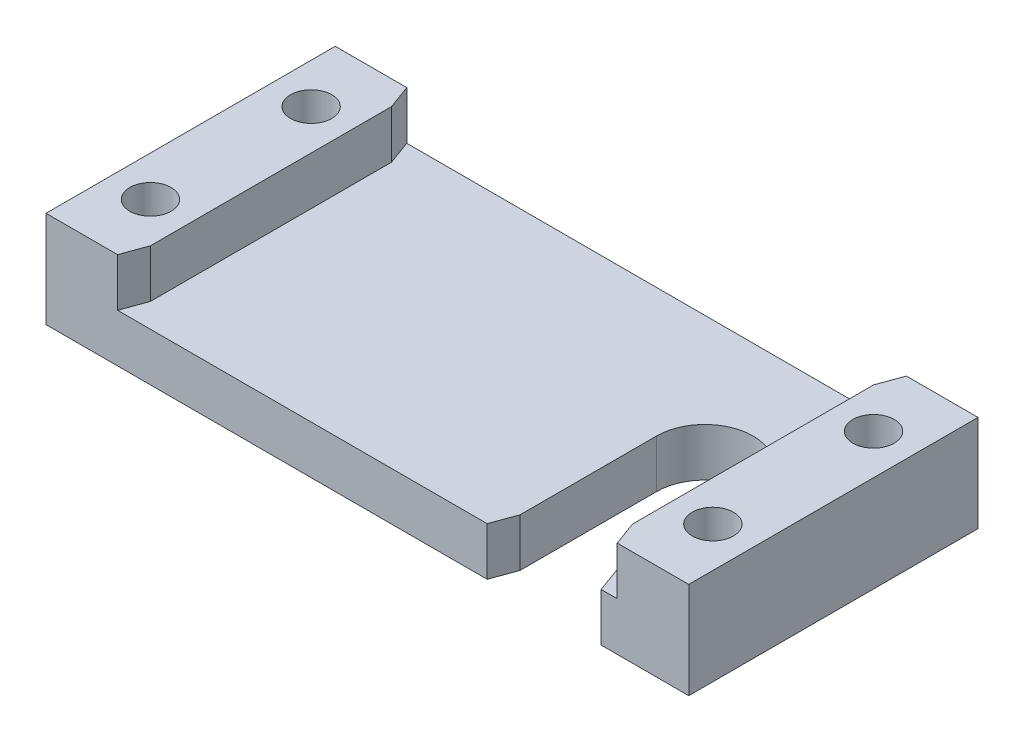
ISO-10303-21;
HEADER;
FILE_DESCRIPTION(('STEP AP214'),'2;1');
FILE_NAME('part.step','',(''),(''),'','','');
FILE_SCHEMA(('AUTOMOTIVE_DESIGN { 1 0 10303 214 1 1 1 1 }'));
ENDSEC;
DATA;
#1=APPLICATION_CONTEXT('core data for automotive mechanical design processes');
#2=APPLICATION_PROTOCOL_DEFINITION('international standard','automotive_design',2000,#1);
#3=PRODUCT_CONTEXT('',#1,'mechanical');
#4=PRODUCT('Part','Part','',(#3));
#5=PRODUCT_RELATED_PRODUCT_CATEGORY('part','',(#4));
#6=PRODUCT_DEFINITION_FORMATION('','',#4);
#7=PRODUCT_DEFINITION_CONTEXT('part definition',#1,'design');
#8=PRODUCT_DEFINITION('design','',#6,#7);
#9=PRODUCT_DEFINITION_SHAPE('','',#8);
#10=(LENGTH_UNIT() NAMED_UNIT(*) SI_UNIT(.MILLI.,.METRE.));
#11=(NAMED_UNIT(*) PLANE_ANGLE_UNIT() SI_UNIT($,.RADIAN.));
#12=(NAMED_UNIT(*) SI_UNIT($,.STERADIAN.) SOLID_ANGLE_UNIT());
#13=UNCERTAINTY_MEASURE_WITH_UNIT(LENGTH_MEASURE(1.E-05),#10,'distance_accuracy_value','');
#14=(GEOMETRIC_REPRESENTATION_CONTEXT(3) GLOBAL_UNCERTAINTY_ASSIGNED_CONTEXT((#13)) GLOBAL_UNIT_ASSIGNED_CONTEXT((#10,
#11,#12)) REPRESENTATION_CONTEXT('',''));
#15=CARTESIAN_POINT('',(0.,0.,0.));
#16=DIRECTION('',(0.,0.,1.));
#17=DIRECTION('',(1.,0.,0.));
#18=AXIS2_PLACEMENT_3D('',#15,#16,#17);
#19=CARTESIAN_POINT('',(0.,0.,11.43));
#20=DIRECTION('',(0.,0.,1.));
#21=DIRECTION('',(1.,0.,0.));
#22=AXIS2_PLACEMENT_3D('',#19,#20,#21);
#23=PLANE('',#22);
#24=DIRECTION('',(1.,0.,0.));
#25=VECTOR('',#24,1.);
#26=CARTESIAN_POINT('',(0.,0.,11.43));
#27=LINE('',#26,#25);
#28=CARTESIAN_POINT('',(18.4733632962771,0.,11.43));
#29=VERTEX_POINT('',#28);
#30=CARTESIAN_POINT('',(19.7433632962771,0.,11.43));
#31=VERTEX_POINT('',#30);
#32=EDGE_CURVE('E252',#29,#31,#27,.T.);
#33=ORIENTED_EDGE('',*,*,#32,.F.);
#34=DIRECTION('',(0.,-1.,0.));
#35=VECTOR('',#34,1.);
#36=CARTESIAN_POINT('',(18.4733632962771,-3.81,11.43));
#37=LINE('',#36,#35);
#38=CARTESIAN_POINT('',(18.4733632962771,-3.81,11.43));
#39=VERTEX_POINT('',#38);
#40=EDGE_CURVE('E344',#29,#39,#37,.T.);
#41=ORIENTED_EDGE('',*,*,#40,.T.);
#42=DIRECTION('',(1.,0.,0.));
#43=VECTOR('',#42,1.);
#44=CARTESIAN_POINT('',(0.,-3.81,11.43));
#45=LINE('',#44,#43);
#46=CARTESIAN_POINT('',(25.4,-3.81,11.43));
#47=VERTEX_POINT('',#46);
#48=EDGE_CURVE('E262',#39,#47,#45,.T.);
#49=ORIENTED_EDGE('',*,*,#48,.T.);
#50=DIRECTION('',(0.,-1.,0.));
#51=VECTOR('',#50,1.);
#52=CARTESIAN_POINT('',(25.4,0.,11.43));
#53=LINE('',#52,#51);
#54=CARTESIAN_POINT('',(25.4,3.81,11.43));
#55=VERTEX_POINT('',#54);
#56=EDGE_CURVE('E267',#55,#47,#53,.T.);
#57=ORIENTED_EDGE('',*,*,#56,.F.);
#58=DIRECTION('',(1.,0.,0.));
#59=VECTOR('',#58,1.);
#60=CARTESIAN_POINT('',(0.,3.81,11.43));
#61=LINE('',#60,#59);
#62=CARTESIAN_POINT('',(19.7433632962771,3.81,11.43));
#63=VERTEX_POINT('',#62);
#64=EDGE_CURVE('E249',#63,#55,#61,.T.);
#65=ORIENTED_EDGE('',*,*,#64,.F.);
#66=DIRECTION('',(0.,-1.,0.));
#67=VECTOR('',#66,1.);
#68=CARTESIAN_POINT('',(19.7433632962771,0.,11.43));
#69=LINE('',#68,#67);
#70=EDGE_CURVE('E340',#63,#31,#69,.T.);
#71=ORIENTED_EDGE('',*,*,#70,.T.);
#72=EDGE_LOOP('',(#33,#41,#49,#57,#65,#71));
#73=FACE_BOUND('',#72,.T.);
#74=ADVANCED_FACE('F45',(#73),#23,.T.);
#75=CARTESIAN_POINT('',(0.,3.81,11.43));
#76=DIRECTION('',(0.,1.,0.));
#77=DIRECTION('',(0.,0.,1.));
#78=AXIS2_PLACEMENT_3D('',#75,#76,#77);
#79=PLANE('',#78);
#80=CARTESIAN_POINT('',(22.225,3.81,6.35));
#81=DIRECTION('',(0.,1.,0.));
#82=DIRECTION('',(0.,0.,1.));
#83=AXIS2_PLACEMENT_3D('',#80,#81,#82);
#84=CIRCLE('',#83,1.63195);
#85=CARTESIAN_POINT('',(22.225,3.81,7.98195));
#86=VERTEX_POINT('',#85);
#87=EDGE_CURVE('E215',#86,#86,#84,.T.);
#88=ORIENTED_EDGE('',*,*,#87,.F.);
#89=EDGE_LOOP('',(#88));
#90=FACE_BOUND('',#89,.T.);
#91=CARTESIAN_POINT('',(22.225,3.81,-6.35));
#92=DIRECTION('',(0.,1.,0.));
#93=DIRECTION('',(0.,0.,1.));
#94=AXIS2_PLACEMENT_3D('',#91,#92,#93);
#95=CIRCLE('',#94,1.63195);
#96=CARTESIAN_POINT('',(22.225,3.81,-4.71805));
#97=VERTEX_POINT('',#96);
#98=EDGE_CURVE('E240',#97,#97,#95,.T.);
#99=ORIENTED_EDGE('',*,*,#98,.F.);
#100=EDGE_LOOP('',(#99));
#101=FACE_BOUND('',#100,.T.);
#102=DIRECTION('',(1.,0.,0.));
#103=VECTOR('',#102,1.);
#104=CARTESIAN_POINT('',(0.,3.81,-11.43));
#105=LINE('',#104,#103);
#106=CARTESIAN_POINT('',(19.7433632962771,3.81,-11.43));
#107=VERTEX_POINT('',#106);
#108=CARTESIAN_POINT('',(25.4,3.81,-11.43));
#109=VERTEX_POINT('',#108);
#110=EDGE_CURVE('E248',#107,#109,#105,.T.);
#111=ORIENTED_EDGE('',*,*,#110,.F.);
#112=DIRECTION('',(0.342020143325667,0.,-0.939692620785909));
#113=VECTOR('',#112,1.);
#114=CARTESIAN_POINT('',(10.0867661402176,3.81,15.1012826350434));
#115=LINE('',#114,#113);
#116=CARTESIAN_POINT('',(19.05,3.81,-9.52499999999997));
#117=VERTEX_POINT('',#116);
#118=EDGE_CURVE('E364',#107,#117,#115,.F.);
#119=ORIENTED_EDGE('',*,*,#118,.T.);
#120=DIRECTION('',(0.,0.,-1.));
#121=VECTOR('',#120,1.);
#122=CARTESIAN_POINT('',(19.05,3.81,11.43));
#123=LINE('',#122,#121);
#124=CARTESIAN_POINT('',(19.05,3.81,9.52499999999997));
#125=VERTEX_POINT('',#124);
#126=EDGE_CURVE('E311',#125,#117,#123,.T.);
#127=ORIENTED_EDGE('',*,*,#126,.F.);
#128=DIRECTION('',(0.342020143325667,0.,0.939692620785909));
#129=VECTOR('',#128,1.);
#130=CARTESIAN_POINT('',(17.4338285189347,3.81,5.08460534980657));
#131=LINE('',#130,#129);
#132=EDGE_CURVE('E361',#125,#63,#131,.T.);
#133=ORIENTED_EDGE('',*,*,#132,.T.);
#134=ORIENTED_EDGE('',*,*,#64,.T.);
#135=DIRECTION('',(0.,0.,-1.));
#136=VECTOR('',#135,1.);
#137=CARTESIAN_POINT('',(25.4,3.81,11.43));
#138=LINE('',#137,#136);
#139=EDGE_CURVE('E271',#55,#109,#138,.T.);
#140=ORIENTED_EDGE('',*,*,#139,.T.);
#141=EDGE_LOOP('',(#111,#119,#127,#133,#134,#140));
#142=FACE_BOUND('',#141,.T.);
#143=ADVANCED_FACE('F420',(#90,#101,#142),#79,.T.);
#144=CARTESIAN_POINT('',(19.05,0.,11.43));
#145=DIRECTION('',(1.,0.,0.));
#146=DIRECTION('',(0.,1.,0.));
#147=AXIS2_PLACEMENT_3D('',#144,#145,#146);
#148=PLANE('',#147);
#149=ORIENTED_EDGE('',*,*,#126,.T.);
#150=DIRECTION('',(0.,-1.,0.));
#151=VECTOR('',#150,1.);
#152=CARTESIAN_POINT('',(19.05,0.,-9.52499999999997));
#153=LINE('',#152,#151);
#154=CARTESIAN_POINT('',(19.05,0.,-9.52499999999997));
#155=VERTEX_POINT('',#154);
#156=EDGE_CURVE('E350',#117,#155,#153,.T.);
#157=ORIENTED_EDGE('',*,*,#156,.T.);
#158=DIRECTION('',(0.,0.,-1.));
#159=VECTOR('',#158,1.);
#160=CARTESIAN_POINT('',(19.05,0.,11.43));
#161=LINE('',#160,#159);
#162=CARTESIAN_POINT('',(19.05,0.,9.52499999999997));
#163=VERTEX_POINT('',#162);
#164=EDGE_CURVE('E307',#163,#155,#161,.T.);
#165=ORIENTED_EDGE('',*,*,#164,.F.);
#166=DIRECTION('',(0.,1.,0.));
#167=VECTOR('',#166,1.);
#168=CARTESIAN_POINT('',(19.05,3.81,9.52499999999997));
#169=LINE('',#168,#167);
#170=EDGE_CURVE('E347',#163,#125,#169,.T.);
#171=ORIENTED_EDGE('',*,*,#170,.T.);
#172=EDGE_LOOP('',(#149,#157,#165,#171));
#173=FACE_BOUND('',#172,.T.);
#174=ADVANCED_FACE('F431',(#173),#148,.F.);
#175=CARTESIAN_POINT('',(0.,0.,11.43));
#176=DIRECTION('',(0.,1.,0.));
#177=DIRECTION('',(0.,0.,1.));
#178=AXIS2_PLACEMENT_3D('',#175,#176,#177);
#179=PLANE('',#178);
#180=CARTESIAN_POINT('',(-19.7433632962771,0.,11.43));
#181=VERTEX_POINT('',#180);
#182=CARTESIAN_POINT('',(9.46663670372289,0.,11.43));
#183=VERTEX_POINT('',#182);
#184=EDGE_CURVE('E255',#181,#183,#27,.T.);
#185=ORIENTED_EDGE('',*,*,#184,.T.);
#186=DIRECTION('',(0.342020143325667,0.,-0.939692620785909));
#187=VECTOR('',#186,1.);
#188=CARTESIAN_POINT('',(8.359250572818,0.,14.4725183892784));
#189=LINE('',#188,#187);
#190=CARTESIAN_POINT('',(10.16,0.,9.52499999999997));
#191=VERTEX_POINT('',#190);
#192=EDGE_CURVE('E325',#183,#191,#189,.T.);
#193=ORIENTED_EDGE('',*,*,#192,.T.);
#194=DIRECTION('',(0.,0.,1.));
#195=VECTOR('',#194,1.);
#196=CARTESIAN_POINT('',(10.16,0.,-1.27));
#197=LINE('',#196,#195);
#198=CARTESIAN_POINT('',(10.16,0.,-1.27));
#199=VERTEX_POINT('',#198);
#200=EDGE_CURVE('E205',#199,#191,#197,.T.);
#201=ORIENTED_EDGE('',*,*,#200,.F.);
#202=CARTESIAN_POINT('',(13.97,0.,-1.27));
#203=DIRECTION('',(0.,1.,0.));
#204=DIRECTION('',(0.,0.,1.));
#205=AXIS2_PLACEMENT_3D('',#202,#203,#204);
#206=CIRCLE('',#205,3.81);
#207=CARTESIAN_POINT('',(17.78,0.,-1.27));
#208=VERTEX_POINT('',#207);
#209=EDGE_CURVE('E181',#208,#199,#206,.T.);
#210=ORIENTED_EDGE('',*,*,#209,.F.);
#211=DIRECTION('',(0.,0.,-1.));
#212=VECTOR('',#211,1.);
#213=CARTESIAN_POINT('',(17.78,0.,11.43));
#214=LINE('',#213,#212);
#215=CARTESIAN_POINT('',(17.78,0.,9.52499999999997));
#216=VERTEX_POINT('',#215);
#217=EDGE_CURVE('E202',#216,#208,#214,.T.);
#218=ORIENTED_EDGE('',*,*,#217,.F.);
#219=DIRECTION('',(0.342020143325667,0.,0.939692620785909));
#220=VECTOR('',#219,1.);
#221=CARTESIAN_POINT('',(16.3123902975542,0.,5.49277548195752));
#222=LINE('',#221,#220);
#223=EDGE_CURVE('E322',#216,#29,#222,.T.);
#224=ORIENTED_EDGE('',*,*,#223,.T.);
#225=ORIENTED_EDGE('',*,*,#32,.T.);
#226=DIRECTION('',(-0.342020143325667,0.,-0.939692620785909));
#227=VECTOR('',#226,1.);
#228=CARTESIAN_POINT('',(19.7433632962771,0.,11.43));
#229=LINE('',#228,#227);
#230=EDGE_CURVE('E382',#31,#163,#229,.T.);
#231=ORIENTED_EDGE('',*,*,#230,.T.);
#232=ORIENTED_EDGE('',*,*,#164,.T.);
#233=DIRECTION('',(-0.342020143325667,0.,0.939692620785909));
#234=VECTOR('',#233,1.);
#235=CARTESIAN_POINT('',(19.05,0.,-9.52499999999997));
#236=LINE('',#235,#234);
#237=CARTESIAN_POINT('',(19.7433632962771,0.,-11.43));
#238=VERTEX_POINT('',#237);
#239=EDGE_CURVE('E378',#155,#238,#236,.F.);
#240=ORIENTED_EDGE('',*,*,#239,.T.);
#241=DIRECTION('',(1.,0.,0.));
#242=VECTOR('',#241,1.);
#243=CARTESIAN_POINT('',(0.,0.,-11.43));
#244=LINE('',#243,#242);
#245=CARTESIAN_POINT('',(-19.7433632962771,0.,-11.43));
#246=VERTEX_POINT('',#245);
#247=EDGE_CURVE('E274',#246,#238,#244,.T.);
#248=ORIENTED_EDGE('',*,*,#247,.F.);
#249=DIRECTION('',(0.342020143325667,0.,0.939692620785909));
#250=VECTOR('',#249,1.);
#251=CARTESIAN_POINT('',(-19.7433632962771,0.,-11.43));
#252=LINE('',#251,#250);
#253=CARTESIAN_POINT('',(-19.05,0.,-9.52499999999997));
#254=VERTEX_POINT('',#253);
#255=EDGE_CURVE('E55',#246,#254,#252,.T.);
#256=ORIENTED_EDGE('',*,*,#255,.T.);
#257=DIRECTION('',(0.,0.,-1.));
#258=VECTOR('',#257,1.);
#259=CARTESIAN_POINT('',(-19.05,0.,11.43));
#260=LINE('',#259,#258);
#261=CARTESIAN_POINT('',(-19.05,0.,9.52499999999997));
#262=VERTEX_POINT('',#261);
#263=EDGE_CURVE('E304',#262,#254,#260,.T.);
#264=ORIENTED_EDGE('',*,*,#263,.F.);
#265=DIRECTION('',(0.342020143325667,0.,-0.939692620785909));
#266=VECTOR('',#265,1.);
#267=CARTESIAN_POINT('',(-19.05,0.,9.52499999999997));
#268=LINE('',#267,#266);
#269=EDGE_CURVE('E11',#262,#181,#268,.F.);
#270=ORIENTED_EDGE('',*,*,#269,.T.);
#271=EDGE_LOOP('',(#185,#193,#201,#210,#218,#224,#225,#231,#232,#240,#248,#256,#264,#270));
#272=FACE_BOUND('',#271,.T.);
#273=ADVANCED_FACE('F388',(#272),#179,.T.);
#274=CARTESIAN_POINT('',(-19.05,0.,11.43));
#275=DIRECTION('',(1.,0.,0.));
#276=DIRECTION('',(0.,1.,0.));
#277=AXIS2_PLACEMENT_3D('',#274,#275,#276);
#278=PLANE('',#277);
#279=ORIENTED_EDGE('',*,*,#263,.T.);
#280=DIRECTION('',(0.,1.,0.));
#281=VECTOR('',#280,1.);
#282=CARTESIAN_POINT('',(-19.05,3.81,-9.52499999999997));
#283=LINE('',#282,#281);
#284=CARTESIAN_POINT('',(-19.05,3.81,-9.52499999999997));
#285=VERTEX_POINT('',#284);
#286=EDGE_CURVE('E62',#254,#285,#283,.T.);
#287=ORIENTED_EDGE('',*,*,#286,.T.);
#288=DIRECTION('',(0.,0.,-1.));
#289=VECTOR('',#288,1.);
#290=CARTESIAN_POINT('',(-19.05,3.81,11.43));
#291=LINE('',#290,#289);
#292=CARTESIAN_POINT('',(-19.05,3.81,9.52499999999997));
#293=VERTEX_POINT('',#292);
#294=EDGE_CURVE('E301',#293,#285,#291,.T.);
#295=ORIENTED_EDGE('',*,*,#294,.F.);
#296=DIRECTION('',(0.,-1.,0.));
#297=VECTOR('',#296,1.);
#298=CARTESIAN_POINT('',(-19.05,0.,9.52499999999997));
#299=LINE('',#298,#297);
#300=EDGE_CURVE('E367',#293,#262,#299,.T.);
#301=ORIENTED_EDGE('',*,*,#300,.T.);
#302=EDGE_LOOP('',(#279,#287,#295,#301));
#303=FACE_BOUND('',#302,.T.);
#304=ADVANCED_FACE('F391',(#303),#278,.T.);
#305=CARTESIAN_POINT('',(-22.225,3.81,-6.35));
#306=DIRECTION('',(0.,1.,0.));
#307=DIRECTION('',(0.,0.,1.));
#308=AXIS2_PLACEMENT_3D('',#305,#306,#307);
#309=CIRCLE('',#308,1.63195);
#310=CARTESIAN_POINT('',(-22.225,3.81,-4.71805));
#311=VERTEX_POINT('',#310);
#312=EDGE_CURVE('E224',#311,#311,#309,.T.);
#313=ORIENTED_EDGE('',*,*,#312,.F.);
#314=EDGE_LOOP('',(#313));
#315=FACE_BOUND('',#314,.T.);
#316=CARTESIAN_POINT('',(-22.225,3.81,6.35));
#317=DIRECTION('',(0.,1.,0.));
#318=DIRECTION('',(0.,0.,1.));
#319=AXIS2_PLACEMENT_3D('',#316,#317,#318);
#320=CIRCLE('',#319,1.63195);
#321=CARTESIAN_POINT('',(-22.225,3.81,7.98195));
#322=VERTEX_POINT('',#321);
#323=EDGE_CURVE('E232',#322,#322,#320,.T.);
#324=ORIENTED_EDGE('',*,*,#323,.F.);
#325=EDGE_LOOP('',(#324));
#326=FACE_BOUND('',#325,.T.);
#327=ORIENTED_EDGE('',*,*,#294,.T.);
#328=DIRECTION('',(-0.342020143325667,0.,-0.939692620785909));
#329=VECTOR('',#328,1.);
#330=CARTESIAN_POINT('',(-10.0867661402176,3.81,15.1012826350434));
#331=LINE('',#330,#329);
#332=CARTESIAN_POINT('',(-19.7433632962771,3.81,-11.43));
#333=VERTEX_POINT('',#332);
#334=EDGE_CURVE('E375',#285,#333,#331,.T.);
#335=ORIENTED_EDGE('',*,*,#334,.T.);
#336=CARTESIAN_POINT('',(-25.4,3.81,-11.43));
#337=VERTEX_POINT('',#336);
#338=EDGE_CURVE('E275',#337,#333,#105,.T.);
#339=ORIENTED_EDGE('',*,*,#338,.F.);
#340=DIRECTION('',(0.,0.,-1.));
#341=VECTOR('',#340,1.);
#342=CARTESIAN_POINT('',(-25.4,3.81,11.43));
#343=LINE('',#342,#341);
#344=CARTESIAN_POINT('',(-25.4,3.81,11.43));
#345=VERTEX_POINT('',#344);
#346=EDGE_CURVE('E298',#345,#337,#343,.T.);
#347=ORIENTED_EDGE('',*,*,#346,.F.);
#348=CARTESIAN_POINT('',(-19.7433632962771,3.81,11.43));
#349=VERTEX_POINT('',#348);
#350=EDGE_CURVE('E254',#345,#349,#61,.T.);
#351=ORIENTED_EDGE('',*,*,#350,.T.);
#352=DIRECTION('',(-0.342020143325667,0.,0.939692620785909));
#353=VECTOR('',#352,1.);
#354=CARTESIAN_POINT('',(-17.4338285189347,3.81,5.08460534980657));
#355=LINE('',#354,#353);
#356=EDGE_CURVE('E69',#349,#293,#355,.F.);
#357=ORIENTED_EDGE('',*,*,#356,.T.);
#358=EDGE_LOOP('',(#327,#335,#339,#347,#351,#357));
#359=FACE_BOUND('',#358,.T.);
#360=ADVANCED_FACE('F397',(#315,#326,#359),#79,.T.);
#361=CARTESIAN_POINT('',(-25.4,0.,11.43));
#362=DIRECTION('',(1.,0.,0.));
#363=DIRECTION('',(0.,1.,0.));
#364=AXIS2_PLACEMENT_3D('',#361,#362,#363);
#365=PLANE('',#364);
#366=DIRECTION('',(0.,-1.,0.));
#367=VECTOR('',#366,1.);
#368=CARTESIAN_POINT('',(-25.4,0.,-11.43));
#369=LINE('',#368,#367);
#370=CARTESIAN_POINT('',(-25.4,-3.81,-11.43));
#371=VERTEX_POINT('',#370);
#372=EDGE_CURVE('E278',#337,#371,#369,.T.);
#373=ORIENTED_EDGE('',*,*,#372,.T.);
#374=DIRECTION('',(0.,0.,-1.));
#375=VECTOR('',#374,1.);
#376=CARTESIAN_POINT('',(-25.4,-3.81,11.43));
#377=LINE('',#376,#375);
#378=CARTESIAN_POINT('',(-25.4,-3.81,11.43));
#379=VERTEX_POINT('',#378);
#380=EDGE_CURVE('E294',#379,#371,#377,.T.);
#381=ORIENTED_EDGE('',*,*,#380,.F.);
#382=DIRECTION('',(0.,-1.,0.));
#383=VECTOR('',#382,1.);
#384=CARTESIAN_POINT('',(-25.4,0.,11.43));
#385=LINE('',#384,#383);
#386=EDGE_CURVE('E259',#345,#379,#385,.T.);
#387=ORIENTED_EDGE('',*,*,#386,.F.);
#388=ORIENTED_EDGE('',*,*,#346,.T.);
#389=EDGE_LOOP('',(#373,#381,#387,#388));
#390=FACE_BOUND('',#389,.T.);
#391=ADVANCED_FACE('F504',(#390),#365,.F.);
#392=CARTESIAN_POINT('',(0.,-3.81,11.43));
#393=DIRECTION('',(0.,1.,0.));
#394=DIRECTION('',(0.,0.,1.));
#395=AXIS2_PLACEMENT_3D('',#392,#393,#394);
#396=PLANE('',#395);
#397=CARTESIAN_POINT('',(22.225,-3.81,6.35));
#398=DIRECTION('',(0.,1.,0.));
#399=DIRECTION('',(0.,0.,1.));
#400=AXIS2_PLACEMENT_3D('',#397,#398,#399);
#401=CIRCLE('',#400,1.63195);
#402=CARTESIAN_POINT('',(22.225,-3.81,7.98195));
#403=VERTEX_POINT('',#402);
#404=EDGE_CURVE('E220',#403,#403,#401,.T.);
#405=ORIENTED_EDGE('',*,*,#404,.T.);
#406=EDGE_LOOP('',(#405));
#407=FACE_BOUND('',#406,.T.);
#408=CARTESIAN_POINT('',(-22.225,-3.81,-6.35));
#409=DIRECTION('',(0.,1.,0.));
#410=DIRECTION('',(0.,0.,1.));
#411=AXIS2_PLACEMENT_3D('',#408,#409,#410);
#412=CIRCLE('',#411,1.63195);
#413=CARTESIAN_POINT('',(-22.225,-3.81,-4.71805));
#414=VERTEX_POINT('',#413);
#415=EDGE_CURVE('E228',#414,#414,#412,.T.);
#416=ORIENTED_EDGE('',*,*,#415,.T.);
#417=EDGE_LOOP('',(#416));
#418=FACE_BOUND('',#417,.T.);
#419=CARTESIAN_POINT('',(-22.225,-3.81,6.35));
#420=DIRECTION('',(0.,1.,0.));
#421=DIRECTION('',(0.,0.,1.));
#422=AXIS2_PLACEMENT_3D('',#419,#420,#421);
#423=CIRCLE('',#422,1.63195);
#424=CARTESIAN_POINT('',(-22.225,-3.81,7.98195));
#425=VERTEX_POINT('',#424);
#426=EDGE_CURVE('E236',#425,#425,#423,.T.);
#427=ORIENTED_EDGE('',*,*,#426,.T.);
#428=EDGE_LOOP('',(#427));
#429=FACE_BOUND('',#428,.T.);
#430=CARTESIAN_POINT('',(22.225,-3.81,-6.35));
#431=DIRECTION('',(0.,1.,0.));
#432=DIRECTION('',(0.,0.,1.));
#433=AXIS2_PLACEMENT_3D('',#430,#431,#432);
#434=CIRCLE('',#433,1.63195);
#435=CARTESIAN_POINT('',(22.225,-3.81,-4.71805));
#436=VERTEX_POINT('',#435);
#437=EDGE_CURVE('E244',#436,#436,#434,.T.);
#438=ORIENTED_EDGE('',*,*,#437,.T.);
#439=EDGE_LOOP('',(#438));
#440=FACE_BOUND('',#439,.T.);
#441=DIRECTION('',(0.,0.,1.));
#442=VECTOR('',#441,1.);
#443=CARTESIAN_POINT('',(10.16,-3.81,-1.27));
#444=LINE('',#443,#442);
#445=CARTESIAN_POINT('',(10.16,-3.81,-1.27));
#446=VERTEX_POINT('',#445);
#447=CARTESIAN_POINT('',(10.16,-3.81,9.52499999999997));
#448=VERTEX_POINT('',#447);
#449=EDGE_CURVE('E190',#446,#448,#444,.T.);
#450=ORIENTED_EDGE('',*,*,#449,.T.);
#451=DIRECTION('',(-0.342020143325667,0.,0.939692620785909));
#452=VECTOR('',#451,1.);
#453=CARTESIAN_POINT('',(9.46663670372289,-3.81,11.43));
#454=LINE('',#453,#452);
#455=CARTESIAN_POINT('',(9.46663670372289,-3.81,11.43));
#456=VERTEX_POINT('',#455);
#457=EDGE_CURVE('E333',#448,#456,#454,.T.);
#458=ORIENTED_EDGE('',*,*,#457,.T.);
#459=EDGE_CURVE('E263',#379,#456,#45,.T.);
#460=ORIENTED_EDGE('',*,*,#459,.F.);
#461=ORIENTED_EDGE('',*,*,#380,.T.);
#462=DIRECTION('',(1.,0.,0.));
#463=VECTOR('',#462,1.);
#464=CARTESIAN_POINT('',(0.,-3.81,-11.43));
#465=LINE('',#464,#463);
#466=CARTESIAN_POINT('',(25.4,-3.81,-11.43));
#467=VERTEX_POINT('',#466);
#468=EDGE_CURVE('E281',#371,#467,#465,.T.);
#469=ORIENTED_EDGE('',*,*,#468,.T.);
#470=DIRECTION('',(0.,0.,-1.));
#471=VECTOR('',#470,1.);
#472=CARTESIAN_POINT('',(25.4,-3.81,11.43));
#473=LINE('',#472,#471);
#474=EDGE_CURVE('E291',#47,#467,#473,.T.);
#475=ORIENTED_EDGE('',*,*,#474,.F.);
#476=ORIENTED_EDGE('',*,*,#48,.F.);
#477=DIRECTION('',(-0.342020143325667,0.,-0.939692620785909));
#478=VECTOR('',#477,1.);
#479=CARTESIAN_POINT('',(17.78,-3.81,9.52499999999997));
#480=LINE('',#479,#478);
#481=CARTESIAN_POINT('',(17.78,-3.81,9.52499999999997));
#482=VERTEX_POINT('',#481);
#483=EDGE_CURVE('E330',#39,#482,#480,.T.);
#484=ORIENTED_EDGE('',*,*,#483,.T.);
#485=DIRECTION('',(0.,0.,-1.));
#486=VECTOR('',#485,1.);
#487=CARTESIAN_POINT('',(17.78,-3.81,11.43));
#488=LINE('',#487,#486);
#489=CARTESIAN_POINT('',(17.78,-3.81,-1.27));
#490=VERTEX_POINT('',#489);
#491=EDGE_CURVE('E187',#482,#490,#488,.T.);
#492=ORIENTED_EDGE('',*,*,#491,.T.);
#493=CARTESIAN_POINT('',(13.97,-3.81,-1.27));
#494=DIRECTION('',(0.,1.,0.));
#495=DIRECTION('',(0.,0.,1.));
#496=AXIS2_PLACEMENT_3D('',#493,#494,#495);
#497=CIRCLE('',#496,3.81);
#498=EDGE_CURVE('E179',#490,#446,#497,.T.);
#499=ORIENTED_EDGE('',*,*,#498,.T.);
#500=EDGE_LOOP('',(#450,#458,#460,#461,#469,#475,#476,#484,#492,#499));
#501=FACE_BOUND('',#500,.T.);
#502=ADVANCED_FACE('F198',(#407,#418,#429,#440,#501),#396,.F.);
#503=CARTESIAN_POINT('',(25.4,0.,11.43));
#504=DIRECTION('',(1.,0.,0.));
#505=DIRECTION('',(0.,1.,0.));
#506=AXIS2_PLACEMENT_3D('',#503,#504,#505);
#507=PLANE('',#506);
#508=DIRECTION('',(0.,-1.,0.));
#509=VECTOR('',#508,1.);
#510=CARTESIAN_POINT('',(25.4,0.,-11.43));
#511=LINE('',#510,#509);
#512=EDGE_CURVE('E253',#109,#467,#511,.T.);
#513=ORIENTED_EDGE('',*,*,#512,.F.);
#514=ORIENTED_EDGE('',*,*,#139,.F.);
#515=ORIENTED_EDGE('',*,*,#56,.T.);
#516=ORIENTED_EDGE('',*,*,#474,.T.);
#517=EDGE_LOOP('',(#513,#514,#515,#516));
#518=FACE_BOUND('',#517,.T.);
#519=ADVANCED_FACE('F417',(#518),#507,.T.);
#520=ORIENTED_EDGE('',*,*,#459,.T.);
#521=DIRECTION('',(0.,1.,0.));
#522=VECTOR('',#521,1.);
#523=CARTESIAN_POINT('',(9.46663670372289,0.,11.43));
#524=LINE('',#523,#522);
#525=EDGE_CURVE('E318',#456,#183,#524,.T.);
#526=ORIENTED_EDGE('',*,*,#525,.T.);
#527=ORIENTED_EDGE('',*,*,#184,.F.);
#528=DIRECTION('',(0.,1.,0.));
#529=VECTOR('',#528,1.);
#530=CARTESIAN_POINT('',(-19.7433632962771,0.,11.43));
#531=LINE('',#530,#529);
#532=EDGE_CURVE('E315',#181,#349,#531,.T.);
#533=ORIENTED_EDGE('',*,*,#532,.T.);
#534=ORIENTED_EDGE('',*,*,#350,.F.);
#535=ORIENTED_EDGE('',*,*,#386,.T.);
#536=EDGE_LOOP('',(#520,#526,#527,#533,#534,#535));
#537=FACE_BOUND('',#536,.T.);
#538=ADVANCED_FACE('F450',(#537),#23,.T.);
#539=CARTESIAN_POINT('',(0.,0.,-11.43));
#540=DIRECTION('',(0.,0.,1.));
#541=DIRECTION('',(1.,0.,0.));
#542=AXIS2_PLACEMENT_3D('',#539,#540,#541);
#543=PLANE('',#542);
#544=ORIENTED_EDGE('',*,*,#247,.T.);
#545=DIRECTION('',(0.,1.,0.));
#546=VECTOR('',#545,1.);
#547=CARTESIAN_POINT('',(19.7433632962771,0.,-11.43));
#548=LINE('',#547,#546);
#549=EDGE_CURVE('E358',#238,#107,#548,.T.);
#550=ORIENTED_EDGE('',*,*,#549,.T.);
#551=ORIENTED_EDGE('',*,*,#110,.T.);
#552=ORIENTED_EDGE('',*,*,#512,.T.);
#553=ORIENTED_EDGE('',*,*,#468,.F.);
#554=ORIENTED_EDGE('',*,*,#372,.F.);
#555=ORIENTED_EDGE('',*,*,#338,.T.);
#556=DIRECTION('',(0.,-1.,0.));
#557=VECTOR('',#556,1.);
#558=CARTESIAN_POINT('',(-19.7433632962771,0.,-11.43));
#559=LINE('',#558,#557);
#560=EDGE_CURVE('E354',#333,#246,#559,.T.);
#561=ORIENTED_EDGE('',*,*,#560,.T.);
#562=EDGE_LOOP('',(#544,#550,#551,#552,#553,#554,#555,#561));
#563=FACE_BOUND('',#562,.T.);
#564=ADVANCED_FACE('F400',(#563),#543,.F.);
#565=CARTESIAN_POINT('',(22.225,3.81,-6.35));
#566=DIRECTION('',(0.,1.,0.));
#567=DIRECTION('',(0.,0.,1.));
#568=AXIS2_PLACEMENT_3D('',#565,#566,#567);
#569=CYLINDRICAL_SURFACE('',#568,1.63195);
#570=ORIENTED_EDGE('',*,*,#437,.F.);
#571=EDGE_LOOP('',(#570));
#572=FACE_BOUND('',#571,.T.);
#573=ORIENTED_EDGE('',*,*,#98,.T.);
#574=EDGE_LOOP('',(#573));
#575=FACE_BOUND('',#574,.T.);
#576=ADVANCED_FACE('F464',(#572,#575),#569,.F.);
#577=CARTESIAN_POINT('',(-22.225,3.81,6.35));
#578=DIRECTION('',(0.,1.,0.));
#579=DIRECTION('',(0.,0.,1.));
#580=AXIS2_PLACEMENT_3D('',#577,#578,#579);
#581=CYLINDRICAL_SURFACE('',#580,1.63195);
#582=ORIENTED_EDGE('',*,*,#426,.F.);
#583=EDGE_LOOP('',(#582));
#584=FACE_BOUND('',#583,.T.);
#585=ORIENTED_EDGE('',*,*,#323,.T.);
#586=EDGE_LOOP('',(#585));
#587=FACE_BOUND('',#586,.T.);
#588=ADVANCED_FACE('F523',(#584,#587),#581,.F.);
#589=CARTESIAN_POINT('',(-22.225,3.81,-6.35));
#590=DIRECTION('',(0.,1.,0.));
#591=DIRECTION('',(0.,0.,1.));
#592=AXIS2_PLACEMENT_3D('',#589,#590,#591);
#593=CYLINDRICAL_SURFACE('',#592,1.63195);
#594=ORIENTED_EDGE('',*,*,#415,.F.);
#595=EDGE_LOOP('',(#594));
#596=FACE_BOUND('',#595,.T.);
#597=ORIENTED_EDGE('',*,*,#312,.T.);
#598=EDGE_LOOP('',(#597));
#599=FACE_BOUND('',#598,.T.);
#600=ADVANCED_FACE('F529',(#596,#599),#593,.F.);
#601=CARTESIAN_POINT('',(22.225,3.81,6.35));
#602=DIRECTION('',(0.,1.,0.));
#603=DIRECTION('',(0.,0.,1.));
#604=AXIS2_PLACEMENT_3D('',#601,#602,#603);
#605=CYLINDRICAL_SURFACE('',#604,1.63195);
#606=ORIENTED_EDGE('',*,*,#404,.F.);
#607=EDGE_LOOP('',(#606));
#608=FACE_BOUND('',#607,.T.);
#609=ORIENTED_EDGE('',*,*,#87,.T.);
#610=EDGE_LOOP('',(#609));
#611=FACE_BOUND('',#610,.T.);
#612=ADVANCED_FACE('F535',(#608,#611),#605,.F.);
#613=CARTESIAN_POINT('',(13.97,-3.81,-1.27));
#614=DIRECTION('',(0.,1.,0.));
#615=DIRECTION('',(0.,0.,1.));
#616=AXIS2_PLACEMENT_3D('',#613,#614,#615);
#617=CYLINDRICAL_SURFACE('',#616,3.81);
#618=ORIENTED_EDGE('',*,*,#209,.T.);
#619=DIRECTION('',(0.,1.,0.));
#620=VECTOR('',#619,1.);
#621=CARTESIAN_POINT('',(10.16,-3.81,-1.27));
#622=LINE('',#621,#620);
#623=EDGE_CURVE('E174',#446,#199,#622,.T.);
#624=ORIENTED_EDGE('',*,*,#623,.F.);
#625=ORIENTED_EDGE('',*,*,#498,.F.);
#626=DIRECTION('',(0.,1.,0.));
#627=VECTOR('',#626,1.);
#628=CARTESIAN_POINT('',(17.78,-3.81,-1.27));
#629=LINE('',#628,#627);
#630=EDGE_CURVE('E186',#490,#208,#629,.T.);
#631=ORIENTED_EDGE('',*,*,#630,.T.);
#632=EDGE_LOOP('',(#618,#624,#625,#631));
#633=FACE_BOUND('',#632,.T.);
#634=ADVANCED_FACE('F176',(#633),#617,.F.);
#635=CARTESIAN_POINT('',(17.78,-3.81,11.43));
#636=DIRECTION('',(1.,0.,0.));
#637=DIRECTION('',(0.,0.,-1.));
#638=AXIS2_PLACEMENT_3D('',#635,#636,#637);
#639=PLANE('',#638);
#640=ORIENTED_EDGE('',*,*,#491,.F.);
#641=DIRECTION('',(0.,1.,0.));
#642=VECTOR('',#641,1.);
#643=CARTESIAN_POINT('',(17.78,0.,9.52499999999997));
#644=LINE('',#643,#642);
#645=EDGE_CURVE('E336',#482,#216,#644,.T.);
#646=ORIENTED_EDGE('',*,*,#645,.T.);
#647=ORIENTED_EDGE('',*,*,#217,.T.);
#648=ORIENTED_EDGE('',*,*,#630,.F.);
#649=EDGE_LOOP('',(#640,#646,#647,#648));
#650=FACE_BOUND('',#649,.T.);
#651=ADVANCED_FACE('F542',(#650),#639,.F.);
#652=CARTESIAN_POINT('',(10.16,-3.81,-1.27));
#653=DIRECTION('',(-1.,0.,0.));
#654=DIRECTION('',(0.,0.,1.));
#655=AXIS2_PLACEMENT_3D('',#652,#653,#654);
#656=PLANE('',#655);
#657=ORIENTED_EDGE('',*,*,#200,.T.);
#658=DIRECTION('',(0.,-1.,0.));
#659=VECTOR('',#658,1.);
#660=CARTESIAN_POINT('',(10.16,-3.81,9.52499999999997));
#661=LINE('',#660,#659);
#662=EDGE_CURVE('E193',#191,#448,#661,.T.);
#663=ORIENTED_EDGE('',*,*,#662,.T.);
#664=ORIENTED_EDGE('',*,*,#449,.F.);
#665=ORIENTED_EDGE('',*,*,#623,.T.);
#666=EDGE_LOOP('',(#657,#663,#664,#665));
#667=FACE_BOUND('',#666,.T.);
#668=ADVANCED_FACE('F191',(#667),#656,.F.);
#669=CARTESIAN_POINT('',(9.46663670372289,0.,11.43));
#670=DIRECTION('',(0.939692620785909,0.,0.342020143325667));
#671=DIRECTION('',(0.,-1.,0.));
#672=AXIS2_PLACEMENT_3D('',#669,#670,#671);
#673=PLANE('',#672);
#674=ORIENTED_EDGE('',*,*,#457,.F.);
#675=ORIENTED_EDGE('',*,*,#662,.F.);
#676=ORIENTED_EDGE('',*,*,#192,.F.);
#677=ORIENTED_EDGE('',*,*,#525,.F.);
#678=EDGE_LOOP('',(#674,#675,#676,#677));
#679=FACE_BOUND('',#678,.T.);
#680=ADVANCED_FACE('F444',(#679),#673,.T.);
#681=CARTESIAN_POINT('',(17.78,-3.81,9.52499999999997));
#682=DIRECTION('',(-0.939692620785909,0.,0.342020143325667));
#683=DIRECTION('',(0.,-1.,0.));
#684=AXIS2_PLACEMENT_3D('',#681,#682,#683);
#685=PLANE('',#684);
#686=ORIENTED_EDGE('',*,*,#483,.F.);
#687=ORIENTED_EDGE('',*,*,#40,.F.);
#688=ORIENTED_EDGE('',*,*,#223,.F.);
#689=ORIENTED_EDGE('',*,*,#645,.F.);
#690=EDGE_LOOP('',(#686,#687,#688,#689));
#691=FACE_BOUND('',#690,.T.);
#692=ADVANCED_FACE('F437',(#691),#685,.T.);
#693=CARTESIAN_POINT('',(19.05,0.,-9.52499999999997));
#694=DIRECTION('',(0.939692620785909,0.,0.342020143325667));
#695=DIRECTION('',(0.,-1.,0.));
#696=AXIS2_PLACEMENT_3D('',#693,#694,#695);
#697=PLANE('',#696);
#698=ORIENTED_EDGE('',*,*,#118,.F.);
#699=ORIENTED_EDGE('',*,*,#549,.F.);
#700=ORIENTED_EDGE('',*,*,#239,.F.);
#701=ORIENTED_EDGE('',*,*,#156,.F.);
#702=EDGE_LOOP('',(#698,#699,#700,#701));
#703=FACE_BOUND('',#702,.T.);
#704=ADVANCED_FACE('F434',(#703),#697,.F.);
#705=CARTESIAN_POINT('',(19.7433632962771,0.,11.43));
#706=DIRECTION('',(-0.939692620785909,0.,0.342020143325667));
#707=DIRECTION('',(0.,1.,0.));
#708=AXIS2_PLACEMENT_3D('',#705,#706,#707);
#709=PLANE('',#708);
#710=ORIENTED_EDGE('',*,*,#132,.F.);
#711=ORIENTED_EDGE('',*,*,#170,.F.);
#712=ORIENTED_EDGE('',*,*,#230,.F.);
#713=ORIENTED_EDGE('',*,*,#70,.F.);
#714=EDGE_LOOP('',(#710,#711,#712,#713));
#715=FACE_BOUND('',#714,.T.);
#716=ADVANCED_FACE('F427',(#715),#709,.T.);
#717=CARTESIAN_POINT('',(-19.7433632962771,0.,-11.43));
#718=DIRECTION('',(0.939692620785909,0.,-0.342020143325667));
#719=DIRECTION('',(0.,1.,0.));
#720=AXIS2_PLACEMENT_3D('',#717,#718,#719);
#721=PLANE('',#720);
#722=ORIENTED_EDGE('',*,*,#334,.F.);
#723=ORIENTED_EDGE('',*,*,#286,.F.);
#724=ORIENTED_EDGE('',*,*,#255,.F.);
#725=ORIENTED_EDGE('',*,*,#560,.F.);
#726=EDGE_LOOP('',(#722,#723,#724,#725));
#727=FACE_BOUND('',#726,.T.);
#728=ADVANCED_FACE('F394',(#727),#721,.T.);
#729=CARTESIAN_POINT('',(-19.05,0.,9.52499999999997));
#730=DIRECTION('',(-0.939692620785909,0.,-0.342020143325667));
#731=DIRECTION('',(0.,-1.,0.));
#732=AXIS2_PLACEMENT_3D('',#729,#730,#731);
#733=PLANE('',#732);
#734=ORIENTED_EDGE('',*,*,#356,.F.);
#735=ORIENTED_EDGE('',*,*,#532,.F.);
#736=ORIENTED_EDGE('',*,*,#269,.F.);
#737=ORIENTED_EDGE('',*,*,#300,.F.);
#738=EDGE_LOOP('',(#734,#735,#736,#737));
#739=FACE_BOUND('',#738,.T.);
#740=ADVANCED_FACE('F48',(#739),#733,.F.);
#741=CLOSED_SHELL('',(#74,#143,#174,#273,#304,#360,#391,#502,#519,#538,#564,#576,#588,#600,#612,
#634,#651,#668,#680,#692,#704,#716,#728,#740));
#742=MANIFOLD_SOLID_BREP('B2',#741);
#743=ADVANCED_BREP_SHAPE_REPRESENTATION('',(#18,#742),#14);
#744=SHAPE_DEFINITION_REPRESENTATION(#9,#743);
ENDSEC;
END-ISO-10303-21;
